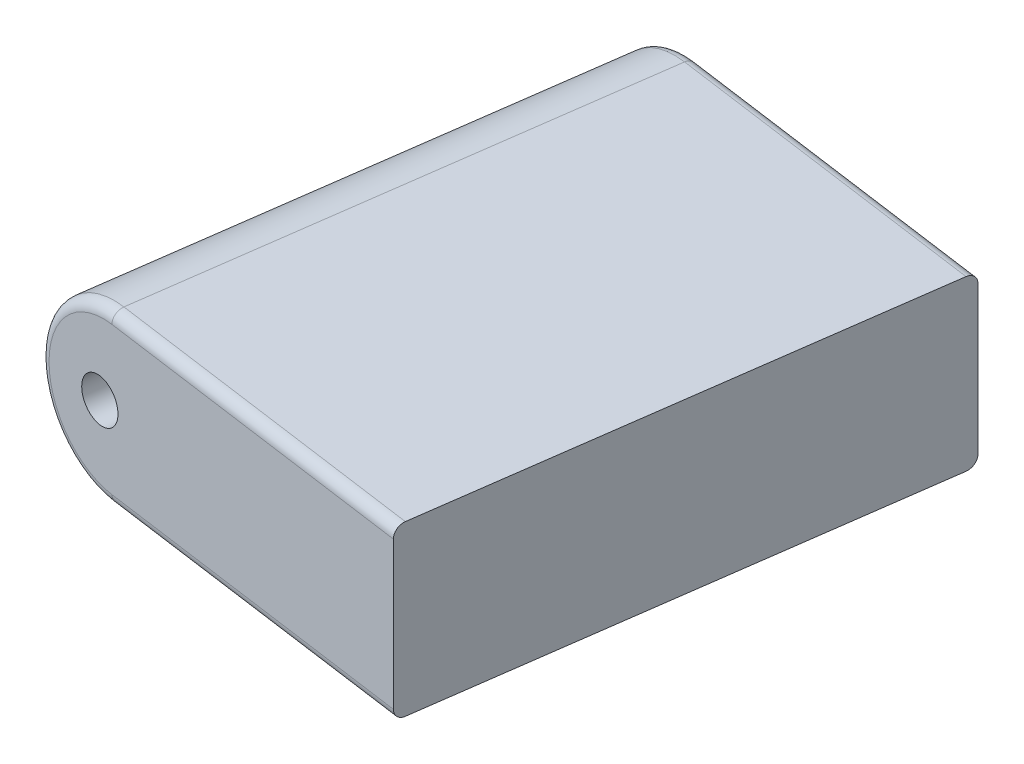
ISO-10303-21;
HEADER;
FILE_DESCRIPTION(('STEP AP214'),'2;1');
FILE_NAME('part.step','',(''),(''),'','','');
FILE_SCHEMA(('AUTOMOTIVE_DESIGN { 1 0 10303 214 1 1 1 1 }'));
ENDSEC;
DATA;
#1=APPLICATION_CONTEXT('core data for automotive mechanical design processes');
#2=APPLICATION_PROTOCOL_DEFINITION('international standard','automotive_design',2000,#1);
#3=PRODUCT_CONTEXT('',#1,'mechanical');
#4=PRODUCT('Part','Part','',(#3));
#5=PRODUCT_RELATED_PRODUCT_CATEGORY('part','',(#4));
#6=PRODUCT_DEFINITION_FORMATION('','',#4);
#7=PRODUCT_DEFINITION_CONTEXT('part definition',#1,'design');
#8=PRODUCT_DEFINITION('design','',#6,#7);
#9=PRODUCT_DEFINITION_SHAPE('','',#8);
#10=(LENGTH_UNIT() NAMED_UNIT(*) SI_UNIT(.MILLI.,.METRE.));
#11=(NAMED_UNIT(*) PLANE_ANGLE_UNIT() SI_UNIT($,.RADIAN.));
#12=(NAMED_UNIT(*) SI_UNIT($,.STERADIAN.) SOLID_ANGLE_UNIT());
#13=UNCERTAINTY_MEASURE_WITH_UNIT(LENGTH_MEASURE(1.E-05),#10,'distance_accuracy_value','');
#14=(GEOMETRIC_REPRESENTATION_CONTEXT(3) GLOBAL_UNCERTAINTY_ASSIGNED_CONTEXT((#13)) GLOBAL_UNIT_ASSIGNED_CONTEXT((#10,
#11,#12)) REPRESENTATION_CONTEXT('',''));
#15=CARTESIAN_POINT('',(0.,0.,0.));
#16=DIRECTION('',(0.,0.,1.));
#17=DIRECTION('',(1.,0.,0.));
#18=AXIS2_PLACEMENT_3D('',#15,#16,#17);
#19=CARTESIAN_POINT('',(-43.3728664758164,3.96875,19.4964664939389));
#20=DIRECTION('',(0.137052139146914,0.,-0.990563834972414));
#21=DIRECTION('',(-0.990563834972414,0.,-0.137052139146914));
#22=AXIS2_PLACEMENT_3D('',#19,#20,#21);
#23=CYLINDRICAL_SURFACE('',#22,1.00000003200001);
#24=CARTESIAN_POINT('',(-42.9262059994108,3.96875,16.2681643514628));
#25=DIRECTION('',(-0.137052139146913,0.,0.990563834972414));
#26=DIRECTION('',(0.990563834972414,0.,0.137052139146913));
#27=AXIS2_PLACEMENT_3D('',#24,#25,#26);
#28=CIRCLE('',#27,1.00000003200001);
#29=CARTESIAN_POINT('',(-41.9356421327404,3.96875,16.4052164949954));
#30=VERTEX_POINT('',#29);
#31=EDGE_CURVE('E286',#30,#30,#28,.F.);
#32=ORIENTED_EDGE('',*,*,#31,.F.);
#33=EDGE_LOOP('',(#32));
#34=FACE_BOUND('',#33,.T.);
#35=CARTESIAN_POINT('',(-40.1029319329844,3.96875,-4.13745064896891));
#36=DIRECTION('',(0.137052139146913,0.,-0.990563834972414));
#37=DIRECTION('',(-0.990563834972414,0.,-0.137052139146913));
#38=AXIS2_PLACEMENT_3D('',#35,#36,#37);
#39=CIRCLE('',#38,1.00000003200001);
#40=CARTESIAN_POINT('',(-41.0934957996549,3.96875,-4.27450279250149));
#41=VERTEX_POINT('',#40);
#42=EDGE_CURVE('E79',#41,#41,#39,.F.);
#43=ORIENTED_EDGE('',*,*,#42,.F.);
#44=EDGE_LOOP('',(#43));
#45=FACE_BOUND('',#44,.T.);
#46=ADVANCED_FACE('F75',(#34,#45),#23,.F.);
#47=CARTESIAN_POINT('',(0.,0.,0.));
#48=DIRECTION('',(0.,-1.,0.));
#49=DIRECTION('',(0.,0.,-1.));
#50=AXIS2_PLACEMENT_3D('',#47,#48,#49);
#51=PLANE('',#50);
#52=DIRECTION('',(-0.990563834972414,0.,-0.137052139146913));
#53=VECTOR('',#52,1.);
#54=CARTESIAN_POINT('',(-24.2493733676485,0.,-5.27542464492166));
#55=LINE('',#54,#53);
#56=CARTESIAN_POINT('',(-38.9902014368317,0.,-7.31493179060167));
#57=VERTEX_POINT('',#56);
#58=CARTESIAN_POINT('',(-23.6183842047711,0.,-5.18812243228508));
#59=VERTEX_POINT('',#58);
#60=EDGE_CURVE('E302',#57,#59,#55,.F.);
#61=ORIENTED_EDGE('',*,*,#60,.T.);
#62=DIRECTION('',(0.137052139146913,0.,-0.990563834972414));
#63=VECTOR('',#62,1.);
#64=CARTESIAN_POINT('',(-26.8254042608088,0.,17.9910713060694));
#65=LINE('',#64,#63);
#66=CARTESIAN_POINT('',(-26.8254042608088,0.,17.9910713060694));
#67=VERTEX_POINT('',#66);
#68=EDGE_CURVE('E213',#67,#59,#65,.T.);
#69=ORIENTED_EDGE('',*,*,#68,.F.);
#70=DIRECTION('',(0.990563834972414,0.,0.137052139146913));
#71=VECTOR('',#70,1.);
#72=CARTESIAN_POINT('',(-2.94631723280965,0.,21.2949269916081));
#73=LINE('',#72,#71);
#74=CARTESIAN_POINT('',(-42.1972214928695,0.,15.8642619477528));
#75=VERTEX_POINT('',#74);
#76=EDGE_CURVE('E304',#67,#75,#73,.F.);
#77=ORIENTED_EDGE('',*,*,#76,.T.);
#78=DIRECTION('',(0.137052139146913,0.,-0.990563834972414));
#79=VECTOR('',#78,1.);
#80=CARTESIAN_POINT('',(-42.7124080388485,0.,19.5878460077151));
#81=LINE('',#80,#79);
#82=EDGE_CURVE('E293',#75,#57,#81,.T.);
#83=ORIENTED_EDGE('',*,*,#82,.T.);
#84=EDGE_LOOP('',(#61,#69,#77,#83));
#85=FACE_BOUND('',#84,.T.);
#86=ADVANCED_FACE('F352',(#85),#51,.T.);
#87=CARTESIAN_POINT('',(0.,7.9375,0.));
#88=DIRECTION('',(0.,-1.,0.));
#89=DIRECTION('',(0.,0.,-1.));
#90=AXIS2_PLACEMENT_3D('',#87,#88,#89);
#91=PLANE('',#90);
#92=DIRECTION('',(0.137052139146913,0.,-0.990563834972414));
#93=VECTOR('',#92,1.);
#94=CARTESIAN_POINT('',(-42.7124080388485,7.9375,19.5878460077151));
#95=LINE('',#94,#93);
#96=CARTESIAN_POINT('',(-42.1972214928695,7.9375,15.8642619477528));
#97=VERTEX_POINT('',#96);
#98=CARTESIAN_POINT('',(-38.9902014368317,7.9375,-7.31493179060166));
#99=VERTEX_POINT('',#98);
#100=EDGE_CURVE('E289',#97,#99,#95,.T.);
#101=ORIENTED_EDGE('',*,*,#100,.F.);
#102=DIRECTION('',(-0.990563834972414,0.,-0.137052139146913));
#103=VECTOR('',#102,1.);
#104=CARTESIAN_POINT('',(-27.4563934236862,7.9375,17.9037690934328));
#105=LINE('',#104,#103);
#106=CARTESIAN_POINT('',(-26.8254042608088,7.9375,17.9910713060694));
#107=VERTEX_POINT('',#106);
#108=EDGE_CURVE('E12',#97,#107,#105,.F.);
#109=ORIENTED_EDGE('',*,*,#108,.T.);
#110=DIRECTION('',(-0.137052139146913,0.,0.990563834972414));
#111=VECTOR('',#110,1.);
#112=CARTESIAN_POINT('',(-23.6183842047711,7.9375,-5.18812243228508));
#113=LINE('',#112,#111);
#114=CARTESIAN_POINT('',(-23.6183842047711,7.9375,-5.18812243228508));
#115=VERTEX_POINT('',#114);
#116=EDGE_CURVE('E217',#115,#107,#113,.T.);
#117=ORIENTED_EDGE('',*,*,#116,.F.);
#118=DIRECTION('',(-0.990563834972414,0.,-0.137052139146913));
#119=VECTOR('',#118,1.);
#120=CARTESIAN_POINT('',(0.260702823228129,7.9375,-1.88426674674641));
#121=LINE('',#120,#119);
#122=EDGE_CURVE('E84',#115,#99,#121,.T.);
#123=ORIENTED_EDGE('',*,*,#122,.T.);
#124=EDGE_LOOP('',(#101,#109,#117,#123));
#125=FACE_BOUND('',#124,.T.);
#126=ADVANCED_FACE('F332',(#125),#91,.F.);
#127=CARTESIAN_POINT('',(-42.7124080388485,3.96875,19.5878460077151));
#128=DIRECTION('',(0.137052139146913,0.,-0.990563834972414));
#129=DIRECTION('',(-0.990563834972414,0.,-0.137052139146913));
#130=AXIS2_PLACEMENT_3D('',#127,#128,#129);
#131=CYLINDRICAL_SURFACE('',#130,3.96875);
#132=ORIENTED_EDGE('',*,*,#82,.F.);
#133=CARTESIAN_POINT('',(-42.1972214928695,3.96875,15.8642619477528));
#134=DIRECTION('',(-0.137052139146913,0.,0.990563834972414));
#135=DIRECTION('',(0.990563834972414,0.,0.137052139146913));
#136=AXIS2_PLACEMENT_3D('',#133,#134,#135);
#137=CIRCLE('',#136,3.96875);
#138=EDGE_CURVE('E308',#75,#97,#137,.F.);
#139=ORIENTED_EDGE('',*,*,#138,.T.);
#140=ORIENTED_EDGE('',*,*,#100,.T.);
#141=CARTESIAN_POINT('',(-38.9902014368317,3.96875,-7.31493179060167));
#142=DIRECTION('',(-0.137052139146913,0.,0.990563834972414));
#143=DIRECTION('',(0.990563834972414,0.,0.137052139146913));
#144=AXIS2_PLACEMENT_3D('',#141,#142,#143);
#145=CIRCLE('',#144,3.96875);
#146=EDGE_CURVE('E306',#99,#57,#145,.T.);
#147=ORIENTED_EDGE('',*,*,#146,.T.);
#148=EDGE_LOOP('',(#132,#139,#140,#147));
#149=FACE_BOUND('',#148,.T.);
#150=ADVANCED_FACE('F354',(#149),#131,.T.);
#151=CARTESIAN_POINT('',(-42.852975587305,7.9375,-8.35413938532718));
#152=DIRECTION('',(-0.137052139146913,0.,0.990563834972414));
#153=DIRECTION('',(0.990563834972414,0.,0.137052139146913));
#154=AXIS2_PLACEMENT_3D('',#151,#152,#153);
#155=PLANE('',#154);
#156=DIRECTION('',(-0.957934346195625,-0.254549746625408,-0.132537597955074));
#157=VECTOR('',#156,1.);
#158=CARTESIAN_POINT('',(-4.02516764218453,16.7003708587668,-2.98201297672226));
#159=LINE('',#158,#157);
#160=CARTESIAN_POINT('',(-39.1522140369657,7.36613955679772,-7.84211050940848));
#161=VERTEX_POINT('',#160);
#162=CARTESIAN_POINT('',(-40.3827029841627,7.03916448697172,-8.01235813652347));
#163=VERTEX_POINT('',#162);
#164=EDGE_CURVE('E255',#161,#163,#159,.T.);
#165=ORIENTED_EDGE('',*,*,#164,.T.);
#166=CARTESIAN_POINT('',(-39.5821338042261,3.96875000000008,-7.90159322186408));
#167=DIRECTION('',(0.137052139146913,0.,-0.990563834972414));
#168=DIRECTION('',(-0.990563834972414,0.,-0.137052139146913));
#169=AXIS2_PLACEMENT_3D('',#166,#167,#168);
#170=CIRCLE('',#169,3.17499999999661);
#171=CARTESIAN_POINT('',(-40.7016128182949,6.93580262421998,-8.05648176936742));
#172=VERTEX_POINT('',#171);
#173=EDGE_CURVE('E229',#172,#163,#170,.T.);
#174=ORIENTED_EDGE('',*,*,#173,.F.);
#175=CARTESIAN_POINT('',(-38.9216753672583,3.96875,-7.81021370808787));
#176=DIRECTION('',(-0.137052139146913,0.,0.990563834972414));
#177=DIRECTION('',(0.990563834972414,0.,0.137052139146913));
#178=AXIS2_PLACEMENT_3D('',#175,#176,#177);
#179=CIRCLE('',#178,3.46875);
#180=CARTESIAN_POINT('',(-38.9216753672583,7.4375,-7.81021370808787));
#181=VERTEX_POINT('',#180);
#182=EDGE_CURVE('E311',#172,#181,#179,.F.);
#183=ORIENTED_EDGE('',*,*,#182,.T.);
#184=DIRECTION('',(-0.990563834972414,0.,-0.137052139146913));
#185=VECTOR('',#184,1.);
#186=CARTESIAN_POINT('',(-42.852975587305,7.4375,-8.35413938532718));
#187=LINE('',#186,#185);
#188=CARTESIAN_POINT('',(-23.5498581351976,7.4375,-5.68340434977129));
#189=VERTEX_POINT('',#188);
#190=EDGE_CURVE('E203',#181,#189,#187,.F.);
#191=ORIENTED_EDGE('',*,*,#190,.T.);
#192=DIRECTION('',(0.,1.,0.));
#193=VECTOR('',#192,1.);
#194=CARTESIAN_POINT('',(-23.5498581351976,0.5,-5.68340434977129));
#195=LINE('',#194,#193);
#196=CARTESIAN_POINT('',(-23.5498581351976,0.5,-5.68340434977129));
#197=VERTEX_POINT('',#196);
#198=EDGE_CURVE('E199',#197,#189,#195,.T.);
#199=ORIENTED_EDGE('',*,*,#198,.F.);
#200=DIRECTION('',(-0.990563834972414,0.,-0.137052139146913));
#201=VECTOR('',#200,1.);
#202=CARTESIAN_POINT('',(-38.9216753672583,0.5,-7.81021370808787));
#203=LINE('',#202,#201);
#204=CARTESIAN_POINT('',(-38.9216753672583,0.500000000000002,-7.81021370808787));
#205=VERTEX_POINT('',#204);
#206=EDGE_CURVE('E189',#197,#205,#203,.T.);
#207=ORIENTED_EDGE('',*,*,#206,.T.);
#208=CARTESIAN_POINT('',(-40.7016128182956,1.00169737578043,-8.0564817693675));
#209=VERTEX_POINT('',#208);
#210=EDGE_CURVE('E196',#205,#209,#179,.F.);
#211=ORIENTED_EDGE('',*,*,#210,.T.);
#212=CARTESIAN_POINT('',(-40.3827029841627,0.898335513028433,-8.01235813652347));
#213=VERTEX_POINT('',#212);
#214=EDGE_CURVE('E92',#213,#209,#170,.T.);
#215=ORIENTED_EDGE('',*,*,#214,.F.);
#216=DIRECTION('',(-0.957934346195625,0.254549746625408,-0.132537597955074));
#217=VECTOR('',#216,1.);
#218=CARTESIAN_POINT('',(-2.08967220289074,-9.27718572347895,-2.71422226914843));
#219=LINE('',#218,#217);
#220=CARTESIAN_POINT('',(-39.1522140369657,0.571360443202432,-7.84211050940848));
#221=VERTEX_POINT('',#220);
#222=EDGE_CURVE('E266',#221,#213,#219,.T.);
#223=ORIENTED_EDGE('',*,*,#222,.F.);
#224=DIRECTION('',(-0.982578460810717,-0.126719768283852,-0.135947301102044));
#225=VECTOR('',#224,1.);
#226=CARTESIAN_POINT('',(-0.375901453884792,5.57220825476139,-2.47710888092826));
#227=LINE('',#226,#225);
#228=CARTESIAN_POINT('',(-25.5413305666348,2.32670932198383,-5.95893990552694));
#229=VERTEX_POINT('',#228);
#230=EDGE_CURVE('E263',#229,#221,#227,.T.);
#231=ORIENTED_EDGE('',*,*,#230,.F.);
#232=CARTESIAN_POINT('',(-29.219548357426,3.96875000000008,-6.46784967860603));
#233=DIRECTION('',(0.137052139146913,0.,-0.990563834972414));
#234=DIRECTION('',(-0.990563834972414,0.,-0.137052139146913));
#235=AXIS2_PLACEMENT_3D('',#232,#233,#234);
#236=CIRCLE('',#235,4.06011980880961);
#237=CARTESIAN_POINT('',(-25.5413305666348,5.61079067801632,-5.95893990552694));
#238=VERTEX_POINT('',#237);
#239=EDGE_CURVE('E260',#238,#229,#236,.T.);
#240=ORIENTED_EDGE('',*,*,#239,.F.);
#241=DIRECTION('',(0.982578460810717,-0.126719768283852,0.135947301102044));
#242=VECTOR('',#241,1.);
#243=CARTESIAN_POINT('',(0.612413457932667,2.23783216657708,-2.34036789762843));
#244=LINE('',#243,#242);
#245=EDGE_CURVE('E257',#161,#238,#244,.T.);
#246=ORIENTED_EDGE('',*,*,#245,.F.);
#247=EDGE_LOOP('',(#165,#174,#183,#191,#199,#207,#211,#215,#223,#231,#240,#246));
#248=FACE_BOUND('',#247,.T.);
#249=ADVANCED_FACE('F201',(#248),#155,.F.);
#250=CARTESIAN_POINT('',(-42.265747562443,3.96875,16.359543865239));
#251=DIRECTION('',(-0.137052139146913,0.,0.990563834972414));
#252=DIRECTION('',(0.990563834972414,0.,0.137052139146913));
#253=AXIS2_PLACEMENT_3D('',#250,#251,#252);
#254=PLANE('',#253);
#255=CARTESIAN_POINT('',(-42.265747562443,3.96875,16.359543865239));
#256=DIRECTION('',(-0.137052139146913,0.,0.990563834972414));
#257=DIRECTION('',(0.990563834972414,0.,0.137052139146913));
#258=AXIS2_PLACEMENT_3D('',#255,#256,#257);
#259=CIRCLE('',#258,3.46875);
#260=CARTESIAN_POINT('',(-42.265747562443,7.4375,16.359543865239));
#261=VERTEX_POINT('',#260);
#262=CARTESIAN_POINT('',(-42.265747562443,0.500000000000002,16.359543865239));
#263=VERTEX_POINT('',#262);
#264=EDGE_CURVE('E298',#261,#263,#259,.T.);
#265=ORIENTED_EDGE('',*,*,#264,.T.);
#266=DIRECTION('',(0.990563834972414,0.,0.137052139146913));
#267=VECTOR('',#266,1.);
#268=CARTESIAN_POINT('',(-42.265747562443,0.5,16.359543865239));
#269=LINE('',#268,#267);
#270=CARTESIAN_POINT('',(-26.8939303303823,0.5,18.4863532235556));
#271=VERTEX_POINT('',#270);
#272=EDGE_CURVE('E300',#263,#271,#269,.T.);
#273=ORIENTED_EDGE('',*,*,#272,.T.);
#274=DIRECTION('',(0.,-1.,0.));
#275=VECTOR('',#274,1.);
#276=CARTESIAN_POINT('',(-26.8939303303823,7.4375,18.4863532235556));
#277=LINE('',#276,#275);
#278=CARTESIAN_POINT('',(-26.8939303303823,7.4375,18.4863532235556));
#279=VERTEX_POINT('',#278);
#280=EDGE_CURVE('E223',#279,#271,#277,.T.);
#281=ORIENTED_EDGE('',*,*,#280,.F.);
#282=DIRECTION('',(-0.990563834972414,0.,-0.137052139146913));
#283=VECTOR('',#282,1.);
#284=CARTESIAN_POINT('',(-42.265747562443,7.4375,16.359543865239));
#285=LINE('',#284,#283);
#286=EDGE_CURVE('E296',#279,#261,#285,.T.);
#287=ORIENTED_EDGE('',*,*,#286,.T.);
#288=EDGE_LOOP('',(#265,#273,#281,#287));
#289=FACE_BOUND('',#288,.T.);
#290=ORIENTED_EDGE('',*,*,#31,.T.);
#291=EDGE_LOOP('',(#290));
#292=FACE_BOUND('',#291,.T.);
#293=ADVANCED_FACE('F344',(#289,#292),#254,.T.);
#294=CARTESIAN_POINT('',(-42.1972214928695,7.4375,15.8642619477528));
#295=DIRECTION('',(0.990563834972414,0.,0.137052139146913));
#296=DIRECTION('',(0.137052139146913,0.,-0.990563834972414));
#297=AXIS2_PLACEMENT_3D('',#294,#295,#296);
#298=CYLINDRICAL_SURFACE('',#297,0.5);
#299=ORIENTED_EDGE('',*,*,#286,.F.);
#300=CARTESIAN_POINT('',(-26.8254042608088,7.4375,17.9910713060694));
#301=DIRECTION('',(0.990563834972414,0.,0.137052139146913));
#302=DIRECTION('',(0.137052139146913,0.,-0.990563834972414));
#303=AXIS2_PLACEMENT_3D('',#300,#301,#302);
#304=CIRCLE('',#303,0.499999999999997);
#305=EDGE_CURVE('E220',#107,#279,#304,.T.);
#306=ORIENTED_EDGE('',*,*,#305,.F.);
#307=ORIENTED_EDGE('',*,*,#108,.F.);
#308=CARTESIAN_POINT('',(-42.1972214928695,7.4375,15.8642619477528));
#309=DIRECTION('',(-0.990563834972413,0.,-0.137052139146915));
#310=DIRECTION('',(-0.137052139146915,0.,0.990563834972414));
#311=AXIS2_PLACEMENT_3D('',#308,#309,#310);
#312=CIRCLE('',#311,0.5);
#313=EDGE_CURVE('E290',#261,#97,#312,.T.);
#314=ORIENTED_EDGE('',*,*,#313,.F.);
#315=EDGE_LOOP('',(#299,#306,#307,#314));
#316=FACE_BOUND('',#315,.T.);
#317=ADVANCED_FACE('F336',(#316),#298,.T.);
#318=CARTESIAN_POINT('',(-42.1972214928695,3.96875,15.8642619477528));
#319=DIRECTION('',(-0.137052139146913,0.,0.990563834972414));
#320=DIRECTION('',(0.990563834972414,0.,0.137052139146913));
#321=AXIS2_PLACEMENT_3D('',#318,#319,#320);
#322=TOROIDAL_SURFACE('',#321,3.46875,0.5);
#323=ORIENTED_EDGE('',*,*,#313,.T.);
#324=ORIENTED_EDGE('',*,*,#138,.F.);
#325=CARTESIAN_POINT('',(-42.1972214928695,0.500000000000002,15.8642619477528));
#326=DIRECTION('',(0.990563834972413,0.,0.137052139146915));
#327=DIRECTION('',(0.137052139146915,0.,-0.990563834972414));
#328=AXIS2_PLACEMENT_3D('',#325,#326,#327);
#329=CIRCLE('',#328,0.5);
#330=EDGE_CURVE('E314',#263,#75,#329,.T.);
#331=ORIENTED_EDGE('',*,*,#330,.F.);
#332=ORIENTED_EDGE('',*,*,#264,.F.);
#333=EDGE_LOOP('',(#323,#324,#331,#332));
#334=FACE_BOUND('',#333,.T.);
#335=ADVANCED_FACE('F340',(#334),#322,.T.);
#336=CARTESIAN_POINT('',(-42.1972214928695,0.5,15.8642619477528));
#337=DIRECTION('',(0.990563834972414,0.,0.137052139146913));
#338=DIRECTION('',(0.137052139146913,0.,-0.990563834972414));
#339=AXIS2_PLACEMENT_3D('',#336,#337,#338);
#340=CYLINDRICAL_SURFACE('',#339,0.5);
#341=ORIENTED_EDGE('',*,*,#330,.T.);
#342=ORIENTED_EDGE('',*,*,#76,.F.);
#343=CARTESIAN_POINT('',(-26.8254042608088,0.5,17.9910713060694));
#344=DIRECTION('',(0.990563834972414,0.,0.137052139146913));
#345=DIRECTION('',(0.137052139146913,0.,-0.990563834972414));
#346=AXIS2_PLACEMENT_3D('',#343,#344,#345);
#347=CIRCLE('',#346,0.499999999999998);
#348=EDGE_CURVE('E226',#271,#67,#347,.T.);
#349=ORIENTED_EDGE('',*,*,#348,.F.);
#350=ORIENTED_EDGE('',*,*,#272,.F.);
#351=EDGE_LOOP('',(#341,#342,#349,#350));
#352=FACE_BOUND('',#351,.T.);
#353=ADVANCED_FACE('F349',(#352),#340,.T.);
#354=CARTESIAN_POINT('',(0.260702823228129,7.4375,-1.88426674674641));
#355=DIRECTION('',(-0.990563834972414,0.,-0.137052139146913));
#356=DIRECTION('',(-0.137052139146913,0.,0.990563834972414));
#357=AXIS2_PLACEMENT_3D('',#354,#355,#356);
#358=CYLINDRICAL_SURFACE('',#357,0.5);
#359=ORIENTED_EDGE('',*,*,#122,.F.);
#360=CARTESIAN_POINT('',(-23.6183842047711,7.4375,-5.18812243228508));
#361=DIRECTION('',(0.990563834972414,0.,0.137052139146913));
#362=DIRECTION('',(0.137052139146913,0.,-0.990563834972414));
#363=AXIS2_PLACEMENT_3D('',#360,#361,#362);
#364=CIRCLE('',#363,0.500000000000001);
#365=EDGE_CURVE('E207',#189,#115,#364,.T.);
#366=ORIENTED_EDGE('',*,*,#365,.F.);
#367=ORIENTED_EDGE('',*,*,#190,.F.);
#368=CARTESIAN_POINT('',(-38.9902014368317,7.4375,-7.31493179060166));
#369=DIRECTION('',(-0.990563834972414,0.,-0.137052139146915));
#370=DIRECTION('',(-0.137052139146915,0.,0.990563834972414));
#371=AXIS2_PLACEMENT_3D('',#368,#369,#370);
#372=CIRCLE('',#371,0.5);
#373=EDGE_CURVE('E317',#99,#181,#372,.T.);
#374=ORIENTED_EDGE('',*,*,#373,.F.);
#375=EDGE_LOOP('',(#359,#366,#367,#374));
#376=FACE_BOUND('',#375,.T.);
#377=ADVANCED_FACE('F77',(#376),#358,.T.);
#378=CARTESIAN_POINT('',(-38.9902014368317,3.96875,-7.31493179060167));
#379=DIRECTION('',(-0.137052139146913,0.,0.990563834972414));
#380=DIRECTION('',(0.990563834972414,0.,0.137052139146913));
#381=AXIS2_PLACEMENT_3D('',#378,#379,#380);
#382=TOROIDAL_SURFACE('',#381,3.46875,0.5);
#383=ORIENTED_EDGE('',*,*,#373,.T.);
#384=ORIENTED_EDGE('',*,*,#182,.F.);
#385=CARTESIAN_POINT('',(-38.9216753672583,3.96875,-7.81021370808788));
#386=DIRECTION('',(0.137052139146913,0.,-0.990563834972414));
#387=DIRECTION('',(-0.990563834972414,0.,-0.137052139146913));
#388=AXIS2_PLACEMENT_3D('',#385,#386,#387);
#389=CIRCLE('',#388,3.46875);
#390=EDGE_CURVE('E234',#209,#172,#389,.T.);
#391=ORIENTED_EDGE('',*,*,#390,.F.);
#392=ORIENTED_EDGE('',*,*,#210,.F.);
#393=CARTESIAN_POINT('',(-38.9902014368317,0.500000000000002,-7.31493179060167));
#394=DIRECTION('',(0.990563834972413,0.,0.137052139146915));
#395=DIRECTION('',(0.137052139146915,0.,-0.990563834972414));
#396=AXIS2_PLACEMENT_3D('',#393,#394,#395);
#397=CIRCLE('',#396,0.5);
#398=EDGE_CURVE('E100',#57,#205,#397,.T.);
#399=ORIENTED_EDGE('',*,*,#398,.F.);
#400=ORIENTED_EDGE('',*,*,#146,.F.);
#401=EDGE_LOOP('',(#383,#384,#391,#392,#399,#400));
#402=FACE_BOUND('',#401,.T.);
#403=ADVANCED_FACE('F325',(#402),#382,.T.);
#404=CARTESIAN_POINT('',(-42.9215016568785,0.5,-7.85885746784098));
#405=DIRECTION('',(0.990563834972414,0.,0.137052139146913));
#406=DIRECTION('',(0.137052139146913,0.,-0.990563834972414));
#407=AXIS2_PLACEMENT_3D('',#404,#405,#406);
#408=CYLINDRICAL_SURFACE('',#407,0.5);
#409=ORIENTED_EDGE('',*,*,#206,.F.);
#410=CARTESIAN_POINT('',(-23.6183842047711,0.5,-5.18812243228508));
#411=DIRECTION('',(0.990563834972414,0.,0.137052139146913));
#412=DIRECTION('',(0.137052139146913,0.,-0.990563834972414));
#413=AXIS2_PLACEMENT_3D('',#410,#411,#412);
#414=CIRCLE('',#413,0.500000000000001);
#415=EDGE_CURVE('E193',#59,#197,#414,.T.);
#416=ORIENTED_EDGE('',*,*,#415,.F.);
#417=ORIENTED_EDGE('',*,*,#60,.F.);
#418=ORIENTED_EDGE('',*,*,#398,.T.);
#419=EDGE_LOOP('',(#409,#416,#417,#418));
#420=FACE_BOUND('',#419,.T.);
#421=ADVANCED_FACE('F191',(#420),#408,.T.);
#422=CARTESIAN_POINT('',(-0.191569235956685,0.,1.38459390866255));
#423=DIRECTION('',(0.137052139146913,0.,-0.990563834972414));
#424=DIRECTION('',(-0.990563834972414,0.,-0.137052139146913));
#425=AXIS2_PLACEMENT_3D('',#422,#423,#424);
#426=PLANE('',#425);
#427=CARTESIAN_POINT('',(-40.1029319329844,3.96875000000008,-4.13745064896891));
#428=DIRECTION('',(0.137052139146913,0.,-0.990563834972414));
#429=DIRECTION('',(-0.990563834972414,0.,-0.137052139146913));
#430=AXIS2_PLACEMENT_3D('',#427,#428,#429);
#431=CIRCLE('',#430,3.17499999999661);
#432=CARTESIAN_POINT('',(-41.2224109470532,6.93580262421998,-4.29233919647225));
#433=VERTEX_POINT('',#432);
#434=CARTESIAN_POINT('',(-40.903501112921,7.03916448697172,-4.2482155636283));
#435=VERTEX_POINT('',#434);
#436=EDGE_CURVE('E230',#433,#435,#431,.T.);
#437=ORIENTED_EDGE('',*,*,#436,.T.);
#438=DIRECTION('',(-0.957934346195625,-0.254549746625408,-0.132537597955074));
#439=VECTOR('',#438,1.);
#440=CARTESIAN_POINT('',(-4.5459657709428,16.7003708587668,0.782129596172916));
#441=LINE('',#440,#439);
#442=CARTESIAN_POINT('',(-39.673012165724,7.36613955679772,-4.0779679365133));
#443=VERTEX_POINT('',#442);
#444=EDGE_CURVE('E233',#443,#435,#441,.T.);
#445=ORIENTED_EDGE('',*,*,#444,.F.);
#446=DIRECTION('',(0.982578460810717,-0.126719768283852,0.135947301102044));
#447=VECTOR('',#446,1.);
#448=CARTESIAN_POINT('',(0.0916153291743967,2.23783216657708,1.42377467526674));
#449=LINE('',#448,#447);
#450=CARTESIAN_POINT('',(-26.0621286953931,5.61079067801632,-2.19479733263177));
#451=VERTEX_POINT('',#450);
#452=EDGE_CURVE('E237',#443,#451,#449,.T.);
#453=ORIENTED_EDGE('',*,*,#452,.T.);
#454=CARTESIAN_POINT('',(-29.7403464861842,3.96875000000008,-2.70370710571086));
#455=DIRECTION('',(0.137052139146913,0.,-0.990563834972414));
#456=DIRECTION('',(-0.990563834972414,0.,-0.137052139146913));
#457=AXIS2_PLACEMENT_3D('',#454,#455,#456);
#458=CIRCLE('',#457,4.06011980880961);
#459=CARTESIAN_POINT('',(-26.0621286953931,2.32670932198383,-2.19479733263177));
#460=VERTEX_POINT('',#459);
#461=EDGE_CURVE('E240',#451,#460,#458,.T.);
#462=ORIENTED_EDGE('',*,*,#461,.T.);
#463=DIRECTION('',(-0.982578460810717,-0.126719768283852,-0.135947301102044));
#464=VECTOR('',#463,1.);
#465=CARTESIAN_POINT('',(-0.896699582643063,5.57220825476139,1.28703369196691));
#466=LINE('',#465,#464);
#467=CARTESIAN_POINT('',(-39.673012165724,0.571360443202432,-4.07796793651331));
#468=VERTEX_POINT('',#467);
#469=EDGE_CURVE('E243',#460,#468,#466,.T.);
#470=ORIENTED_EDGE('',*,*,#469,.T.);
#471=DIRECTION('',(-0.957934346195625,0.254549746625408,-0.132537597955074));
#472=VECTOR('',#471,1.);
#473=CARTESIAN_POINT('',(-2.61047033164901,-9.27718572347895,1.04992030374674));
#474=LINE('',#473,#472);
#475=CARTESIAN_POINT('',(-40.903501112921,0.898335513028433,-4.2482155636283));
#476=VERTEX_POINT('',#475);
#477=EDGE_CURVE('E246',#468,#476,#474,.T.);
#478=ORIENTED_EDGE('',*,*,#477,.T.);
#479=CARTESIAN_POINT('',(-41.2224109470539,1.00169737578043,-4.29233919647234));
#480=VERTEX_POINT('',#479);
#481=EDGE_CURVE('E235',#476,#480,#431,.T.);
#482=ORIENTED_EDGE('',*,*,#481,.T.);
#483=CARTESIAN_POINT('',(-39.4424734960165,3.96875,-4.04607113519271));
#484=DIRECTION('',(0.137052139146913,0.,-0.990563834972414));
#485=DIRECTION('',(-0.990563834972414,0.,-0.137052139146913));
#486=AXIS2_PLACEMENT_3D('',#483,#484,#485);
#487=CIRCLE('',#486,3.46875);
#488=EDGE_CURVE('E249',#480,#433,#487,.T.);
#489=ORIENTED_EDGE('',*,*,#488,.T.);
#490=EDGE_LOOP('',(#437,#445,#453,#462,#470,#478,#482,#489));
#491=FACE_BOUND('',#490,.T.);
#492=ORIENTED_EDGE('',*,*,#42,.T.);
#493=EDGE_LOOP('',(#492));
#494=FACE_BOUND('',#493,.T.);
#495=ADVANCED_FACE('F382',(#491,#494),#426,.T.);
#496=CARTESIAN_POINT('',(-40.1029319329844,3.96875000000008,-4.13745064896891));
#497=DIRECTION('',(0.137052139146913,0.,-0.990563834972414));
#498=DIRECTION('',(-0.990563834972414,0.,-0.137052139146913));
#499=AXIS2_PLACEMENT_3D('',#496,#497,#498);
#500=CYLINDRICAL_SURFACE('',#499,3.17499999999661);
#501=ORIENTED_EDGE('',*,*,#173,.T.);
#502=DIRECTION('',(0.137052139146913,0.,-0.990563834972414));
#503=VECTOR('',#502,1.);
#504=CARTESIAN_POINT('',(-40.903501112921,7.03916448697172,-4.2482155636283));
#505=LINE('',#504,#503);
#506=EDGE_CURVE('E252',#435,#163,#505,.T.);
#507=ORIENTED_EDGE('',*,*,#506,.F.);
#508=ORIENTED_EDGE('',*,*,#436,.F.);
#509=DIRECTION('',(0.137052139146913,0.,-0.990563834972414));
#510=VECTOR('',#509,1.);
#511=CARTESIAN_POINT('',(-41.2224109470532,6.93580262421998,-4.29233919647225));
#512=LINE('',#511,#510);
#513=EDGE_CURVE('E271',#433,#172,#512,.T.);
#514=ORIENTED_EDGE('',*,*,#513,.T.);
#515=EDGE_LOOP('',(#501,#507,#508,#514));
#516=FACE_BOUND('',#515,.T.);
#517=ADVANCED_FACE('F462',(#516),#500,.F.);
#518=CARTESIAN_POINT('',(-39.4424734960165,3.96875,-4.04607113519271));
#519=DIRECTION('',(0.137052139146913,0.,-0.990563834972414));
#520=DIRECTION('',(-0.990563834972414,0.,-0.137052139146913));
#521=AXIS2_PLACEMENT_3D('',#518,#519,#520);
#522=CYLINDRICAL_SURFACE('',#521,3.46875);
#523=ORIENTED_EDGE('',*,*,#390,.T.);
#524=ORIENTED_EDGE('',*,*,#513,.F.);
#525=ORIENTED_EDGE('',*,*,#488,.F.);
#526=DIRECTION('',(0.137052139146913,0.,-0.990563834972414));
#527=VECTOR('',#526,1.);
#528=CARTESIAN_POINT('',(-41.2224109470539,1.00169737578043,-4.29233919647234));
#529=LINE('',#528,#527);
#530=EDGE_CURVE('E273',#480,#209,#529,.T.);
#531=ORIENTED_EDGE('',*,*,#530,.T.);
#532=EDGE_LOOP('',(#523,#524,#525,#531));
#533=FACE_BOUND('',#532,.T.);
#534=ADVANCED_FACE('F460',(#533),#522,.F.);
#535=ORIENTED_EDGE('',*,*,#214,.T.);
#536=ORIENTED_EDGE('',*,*,#530,.F.);
#537=ORIENTED_EDGE('',*,*,#481,.F.);
#538=DIRECTION('',(0.137052139146913,0.,-0.990563834972414));
#539=VECTOR('',#538,1.);
#540=CARTESIAN_POINT('',(-40.903501112921,0.898335513028433,-4.2482155636283));
#541=LINE('',#540,#539);
#542=EDGE_CURVE('E275',#476,#213,#541,.T.);
#543=ORIENTED_EDGE('',*,*,#542,.T.);
#544=EDGE_LOOP('',(#535,#536,#537,#543));
#545=FACE_BOUND('',#544,.T.);
#546=ADVANCED_FACE('F450',(#545),#500,.F.);
#547=CARTESIAN_POINT('',(-2.61047033164901,-9.27718572347895,1.04992030374674));
#548=DIRECTION('',(-0.25214777320852,-0.967059680936467,-0.0348865872943169));
#549=DIRECTION('',(0.967648710244236,-0.252301354658803,0.));
#550=AXIS2_PLACEMENT_3D('',#547,#548,#549);
#551=PLANE('',#550);
#552=ORIENTED_EDGE('',*,*,#222,.T.);
#553=ORIENTED_EDGE('',*,*,#542,.F.);
#554=ORIENTED_EDGE('',*,*,#477,.F.);
#555=DIRECTION('',(0.137052139146913,0.,-0.990563834972414));
#556=VECTOR('',#555,1.);
#557=CARTESIAN_POINT('',(-39.673012165724,0.571360443202432,-4.07796793651331));
#558=LINE('',#557,#556);
#559=EDGE_CURVE('E277',#468,#221,#558,.T.);
#560=ORIENTED_EDGE('',*,*,#559,.T.);
#561=EDGE_LOOP('',(#552,#553,#554,#560));
#562=FACE_BOUND('',#561,.T.);
#563=ADVANCED_FACE('F441',(#562),#551,.F.);
#564=CARTESIAN_POINT('',(-0.896699582643063,5.57220825476139,1.28703369196691));
#565=DIRECTION('',(0.125524019638068,-0.99193855672924,0.0173672153155031));
#566=DIRECTION('',(0.992088184915221,0.125542954209396,0.));
#567=AXIS2_PLACEMENT_3D('',#564,#565,#566);
#568=PLANE('',#567);
#569=ORIENTED_EDGE('',*,*,#230,.T.);
#570=ORIENTED_EDGE('',*,*,#559,.F.);
#571=ORIENTED_EDGE('',*,*,#469,.F.);
#572=DIRECTION('',(0.137052139146913,0.,-0.990563834972414));
#573=VECTOR('',#572,1.);
#574=CARTESIAN_POINT('',(-26.0621286953931,2.32670932198383,-2.19479733263177));
#575=LINE('',#574,#573);
#576=EDGE_CURVE('E279',#460,#229,#575,.T.);
#577=ORIENTED_EDGE('',*,*,#576,.T.);
#578=EDGE_LOOP('',(#569,#570,#571,#577));
#579=FACE_BOUND('',#578,.T.);
#580=ADVANCED_FACE('F432',(#579),#568,.F.);
#581=CARTESIAN_POINT('',(-29.7403464861842,3.96875000000008,-2.70370710571086));
#582=DIRECTION('',(0.137052139146913,0.,-0.990563834972414));
#583=DIRECTION('',(-0.990563834972414,0.,-0.137052139146913));
#584=AXIS2_PLACEMENT_3D('',#581,#582,#583);
#585=CYLINDRICAL_SURFACE('',#584,4.06011980880961);
#586=ORIENTED_EDGE('',*,*,#239,.T.);
#587=ORIENTED_EDGE('',*,*,#576,.F.);
#588=ORIENTED_EDGE('',*,*,#461,.F.);
#589=DIRECTION('',(0.137052139146913,0.,-0.990563834972414));
#590=VECTOR('',#589,1.);
#591=CARTESIAN_POINT('',(-26.0621286953931,5.61079067801632,-2.19479733263177));
#592=LINE('',#591,#590);
#593=EDGE_CURVE('E281',#451,#238,#592,.T.);
#594=ORIENTED_EDGE('',*,*,#593,.T.);
#595=EDGE_LOOP('',(#586,#587,#588,#594));
#596=FACE_BOUND('',#595,.T.);
#597=ADVANCED_FACE('F423',(#596),#585,.F.);
#598=CARTESIAN_POINT('',(0.0916153291743967,2.23783216657708,1.42377467526674));
#599=DIRECTION('',(0.125524019638068,0.99193855672924,0.0173672153155031));
#600=DIRECTION('',(-0.992088184915221,0.125542954209397,0.));
#601=AXIS2_PLACEMENT_3D('',#598,#599,#600);
#602=PLANE('',#601);
#603=ORIENTED_EDGE('',*,*,#245,.T.);
#604=ORIENTED_EDGE('',*,*,#593,.F.);
#605=ORIENTED_EDGE('',*,*,#452,.F.);
#606=DIRECTION('',(0.137052139146913,0.,-0.990563834972414));
#607=VECTOR('',#606,1.);
#608=CARTESIAN_POINT('',(-39.673012165724,7.36613955679772,-4.0779679365133));
#609=LINE('',#608,#607);
#610=EDGE_CURVE('E283',#443,#161,#609,.T.);
#611=ORIENTED_EDGE('',*,*,#610,.T.);
#612=EDGE_LOOP('',(#603,#604,#605,#611));
#613=FACE_BOUND('',#612,.T.);
#614=ADVANCED_FACE('F413',(#613),#602,.F.);
#615=CARTESIAN_POINT('',(-4.5459657709428,16.7003708587668,0.782129596172916));
#616=DIRECTION('',(0.252147773208521,-0.967059680936466,0.034886587294317));
#617=DIRECTION('',(0.967648710244235,0.252301354658804,0.));
#618=AXIS2_PLACEMENT_3D('',#615,#616,#617);
#619=PLANE('',#618);
#620=ORIENTED_EDGE('',*,*,#164,.F.);
#621=ORIENTED_EDGE('',*,*,#610,.F.);
#622=ORIENTED_EDGE('',*,*,#444,.T.);
#623=ORIENTED_EDGE('',*,*,#506,.T.);
#624=EDGE_LOOP('',(#620,#621,#622,#623));
#625=FACE_BOUND('',#624,.T.);
#626=ADVANCED_FACE('F402',(#625),#619,.T.);
#627=CARTESIAN_POINT('',(-23.6183842047711,0.5,-5.18812243228508));
#628=DIRECTION('',(0.990563834972414,0.,0.137052139146913));
#629=DIRECTION('',(0.137052139146913,0.,-0.990563834972414));
#630=AXIS2_PLACEMENT_3D('',#627,#628,#629);
#631=PLANE('',#630);
#632=ORIENTED_EDGE('',*,*,#415,.T.);
#633=ORIENTED_EDGE('',*,*,#198,.T.);
#634=ORIENTED_EDGE('',*,*,#365,.T.);
#635=ORIENTED_EDGE('',*,*,#116,.T.);
#636=ORIENTED_EDGE('',*,*,#305,.T.);
#637=ORIENTED_EDGE('',*,*,#280,.T.);
#638=ORIENTED_EDGE('',*,*,#348,.T.);
#639=ORIENTED_EDGE('',*,*,#68,.T.);
#640=EDGE_LOOP('',(#632,#633,#634,#635,#636,#637,#638,#639));
#641=FACE_BOUND('',#640,.T.);
#642=ADVANCED_FACE('F210',(#641),#631,.T.);
#643=CLOSED_SHELL('',(#46,#86,#126,#150,#249,#293,#317,#335,#353,#377,#403,#421,#495,#517,#534,
#546,#563,#580,#597,#614,#626,#642));
#644=MANIFOLD_SOLID_BREP('B2',#643);
#645=ADVANCED_BREP_SHAPE_REPRESENTATION('',(#18,#644),#14);
#646=SHAPE_DEFINITION_REPRESENTATION(#9,#645);
ENDSEC;
END-ISO-10303-21;
